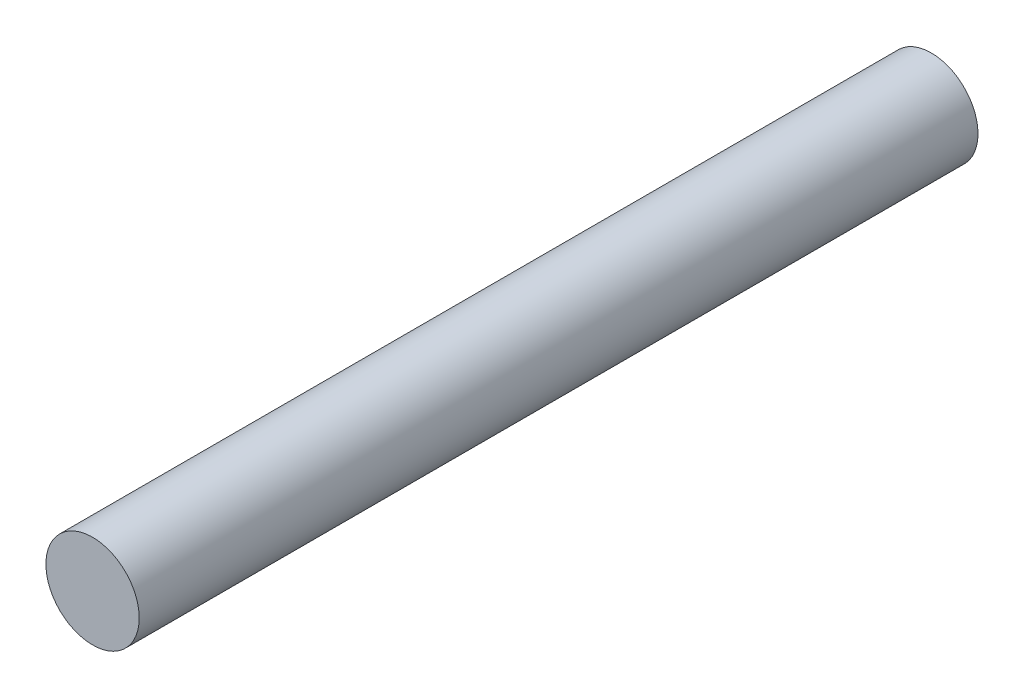
ISO-10303-21;
HEADER;
FILE_DESCRIPTION(('STEP AP214'),'2;1');
FILE_NAME('part.step','',(''),(''),'','','');
FILE_SCHEMA(('AUTOMOTIVE_DESIGN { 1 0 10303 214 1 1 1 1 }'));
ENDSEC;
DATA;
#1=APPLICATION_CONTEXT('core data for automotive mechanical design processes');
#2=APPLICATION_PROTOCOL_DEFINITION('international standard','automotive_design',2000,#1);
#3=PRODUCT_CONTEXT('',#1,'mechanical');
#4=PRODUCT('Part','Part','',(#3));
#5=PRODUCT_RELATED_PRODUCT_CATEGORY('part','',(#4));
#6=PRODUCT_DEFINITION_FORMATION('','',#4);
#7=PRODUCT_DEFINITION_CONTEXT('part definition',#1,'design');
#8=PRODUCT_DEFINITION('design','',#6,#7);
#9=PRODUCT_DEFINITION_SHAPE('','',#8);
#10=(LENGTH_UNIT() NAMED_UNIT(*) SI_UNIT(.MILLI.,.METRE.));
#11=(NAMED_UNIT(*) PLANE_ANGLE_UNIT() SI_UNIT($,.RADIAN.));
#12=(NAMED_UNIT(*) SI_UNIT($,.STERADIAN.) SOLID_ANGLE_UNIT());
#13=UNCERTAINTY_MEASURE_WITH_UNIT(LENGTH_MEASURE(1.E-05),#10,'distance_accuracy_value','');
#14=(GEOMETRIC_REPRESENTATION_CONTEXT(3) GLOBAL_UNCERTAINTY_ASSIGNED_CONTEXT((#13)) GLOBAL_UNIT_ASSIGNED_CONTEXT((#10,
#11,#12)) REPRESENTATION_CONTEXT('',''));
#15=CARTESIAN_POINT('',(0.,0.,0.));
#16=DIRECTION('',(0.,0.,1.));
#17=DIRECTION('',(1.,0.,0.));
#18=AXIS2_PLACEMENT_3D('',#15,#16,#17);
#19=CARTESIAN_POINT('',(0.,0.,-2.));
#20=DIRECTION('',(0.,0.,1.));
#21=DIRECTION('',(1.,0.,0.));
#22=AXIS2_PLACEMENT_3D('',#19,#20,#21);
#23=CYLINDRICAL_SURFACE('',#22,4.95);
#24=CARTESIAN_POINT('',(0.,0.,-2.));
#25=DIRECTION('',(0.,0.,1.));
#26=DIRECTION('',(1.,0.,0.));
#27=AXIS2_PLACEMENT_3D('',#24,#25,#26);
#28=CIRCLE('',#27,4.95);
#29=CARTESIAN_POINT('',(4.95,0.,-2.));
#30=VERTEX_POINT('',#29);
#31=EDGE_CURVE('E10',#30,#30,#28,.T.);
#32=ORIENTED_EDGE('',*,*,#31,.T.);
#33=EDGE_LOOP('',(#32));
#34=FACE_BOUND('',#33,.T.);
#35=CARTESIAN_POINT('',(0.,0.,86.9999999999999));
#36=DIRECTION('',(0.,0.,1.));
#37=DIRECTION('',(1.,0.,0.));
#38=AXIS2_PLACEMENT_3D('',#35,#36,#37);
#39=CIRCLE('',#38,4.95);
#40=CARTESIAN_POINT('',(4.95,0.,86.9999999999999));
#41=VERTEX_POINT('',#40);
#42=EDGE_CURVE('E37',#41,#41,#39,.T.);
#43=ORIENTED_EDGE('',*,*,#42,.F.);
#44=EDGE_LOOP('',(#43));
#45=FACE_BOUND('',#44,.T.);
#46=ADVANCED_FACE('F31',(#34,#45),#23,.T.);
#47=CARTESIAN_POINT('',(0.,0.,-2.));
#48=DIRECTION('',(0.,0.,1.));
#49=DIRECTION('',(1.,0.,0.));
#50=AXIS2_PLACEMENT_3D('',#47,#48,#49);
#51=PLANE('',#50);
#52=ORIENTED_EDGE('',*,*,#31,.F.);
#53=EDGE_LOOP('',(#52));
#54=FACE_BOUND('',#53,.T.);
#55=ADVANCED_FACE('F46',(#54),#51,.F.);
#56=CARTESIAN_POINT('',(0.,0.,86.9999999999999));
#57=DIRECTION('',(0.,0.,1.));
#58=DIRECTION('',(1.,0.,0.));
#59=AXIS2_PLACEMENT_3D('',#56,#57,#58);
#60=PLANE('',#59);
#61=ORIENTED_EDGE('',*,*,#42,.T.);
#62=EDGE_LOOP('',(#61));
#63=FACE_BOUND('',#62,.T.);
#64=ADVANCED_FACE('F43',(#63),#60,.T.);
#65=CLOSED_SHELL('',(#46,#55,#64));
#66=MANIFOLD_SOLID_BREP('B2',#65);
#67=ADVANCED_BREP_SHAPE_REPRESENTATION('',(#18,#66),#14);
#68=SHAPE_DEFINITION_REPRESENTATION(#9,#67);
ENDSEC;
END-ISO-10303-21;
